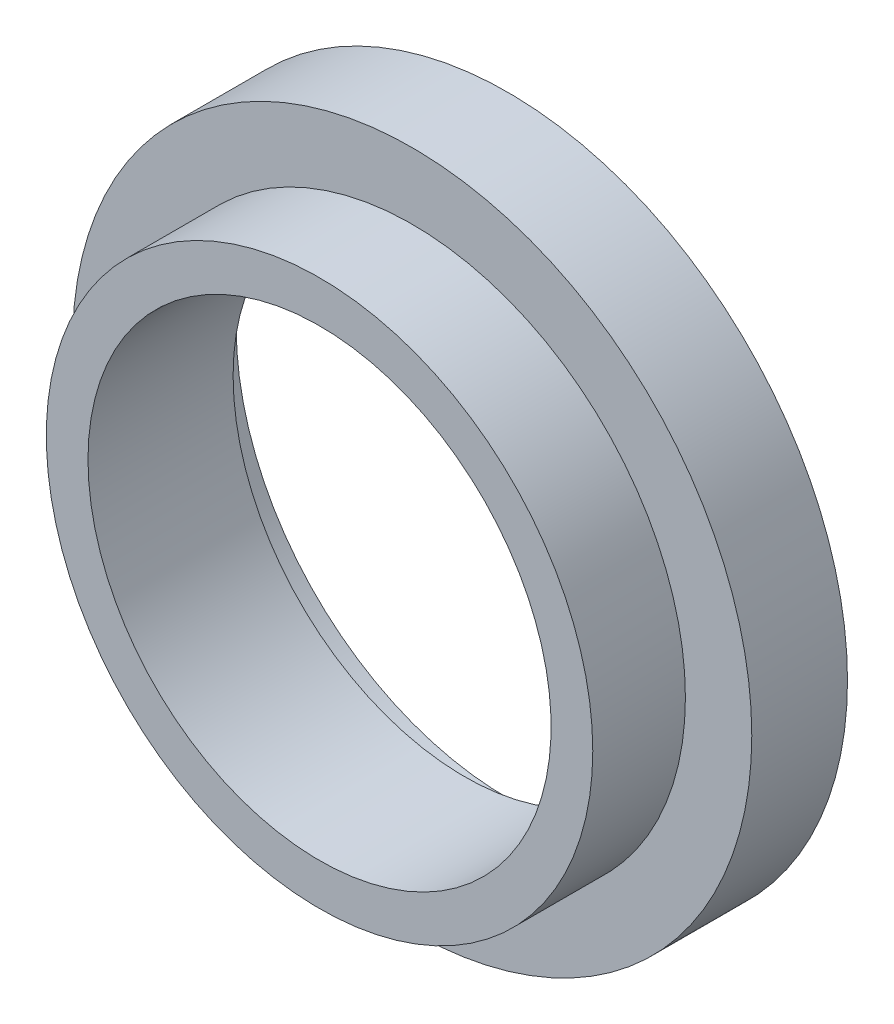
ISO-10303-21;
HEADER;
FILE_DESCRIPTION(('STEP AP214'),'2;1');
FILE_NAME('part.step','',(''),(''),'','','');
FILE_SCHEMA(('AUTOMOTIVE_DESIGN { 1 0 10303 214 1 1 1 1 }'));
ENDSEC;
DATA;
#1=APPLICATION_CONTEXT('core data for automotive mechanical design processes');
#2=APPLICATION_PROTOCOL_DEFINITION('international standard','automotive_design',2000,#1);
#3=PRODUCT_CONTEXT('',#1,'mechanical');
#4=PRODUCT('Part','Part','',(#3));
#5=PRODUCT_RELATED_PRODUCT_CATEGORY('part','',(#4));
#6=PRODUCT_DEFINITION_FORMATION('','',#4);
#7=PRODUCT_DEFINITION_CONTEXT('part definition',#1,'design');
#8=PRODUCT_DEFINITION('design','',#6,#7);
#9=PRODUCT_DEFINITION_SHAPE('','',#8);
#10=(LENGTH_UNIT() NAMED_UNIT(*) SI_UNIT(.MILLI.,.METRE.));
#11=(NAMED_UNIT(*) PLANE_ANGLE_UNIT() SI_UNIT($,.RADIAN.));
#12=(NAMED_UNIT(*) SI_UNIT($,.STERADIAN.) SOLID_ANGLE_UNIT());
#13=UNCERTAINTY_MEASURE_WITH_UNIT(LENGTH_MEASURE(1.E-05),#10,'distance_accuracy_value','');
#14=(GEOMETRIC_REPRESENTATION_CONTEXT(3) GLOBAL_UNCERTAINTY_ASSIGNED_CONTEXT((#13)) GLOBAL_UNIT_ASSIGNED_CONTEXT((#10,
#11,#12)) REPRESENTATION_CONTEXT('',''));
#15=CARTESIAN_POINT('',(0.,0.,0.));
#16=DIRECTION('',(0.,0.,1.));
#17=DIRECTION('',(1.,0.,0.));
#18=AXIS2_PLACEMENT_3D('',#15,#16,#17);
#19=CARTESIAN_POINT('',(0.,0.,15.5));
#20=DIRECTION('',(0.,0.,-1.));
#21=DIRECTION('',(-1.,0.,0.));
#22=AXIS2_PLACEMENT_3D('',#19,#20,#21);
#23=CYLINDRICAL_SURFACE('',#22,55.);
#24=CARTESIAN_POINT('',(0.,0.,15.5));
#25=DIRECTION('',(0.,0.,1.));
#26=DIRECTION('',(1.,0.,0.));
#27=AXIS2_PLACEMENT_3D('',#24,#25,#26);
#28=CIRCLE('',#27,55.);
#29=CARTESIAN_POINT('',(55.,0.,15.5));
#30=VERTEX_POINT('',#29);
#31=EDGE_CURVE('E41',#30,#30,#28,.T.);
#32=ORIENTED_EDGE('',*,*,#31,.F.);
#33=EDGE_LOOP('',(#32));
#34=FACE_BOUND('',#33,.T.);
#35=CARTESIAN_POINT('',(0.,0.,0.));
#36=DIRECTION('',(0.,0.,1.));
#37=DIRECTION('',(1.,0.,0.));
#38=AXIS2_PLACEMENT_3D('',#35,#36,#37);
#39=CIRCLE('',#38,55.);
#40=CARTESIAN_POINT('',(55.,0.,0.));
#41=VERTEX_POINT('',#40);
#42=EDGE_CURVE('E46',#41,#41,#39,.T.);
#43=ORIENTED_EDGE('',*,*,#42,.T.);
#44=EDGE_LOOP('',(#43));
#45=FACE_BOUND('',#44,.T.);
#46=ADVANCED_FACE('F34',(#34,#45),#23,.T.);
#47=CARTESIAN_POINT('',(0.,0.,15.5));
#48=DIRECTION('',(0.,0.,1.));
#49=DIRECTION('',(1.,0.,0.));
#50=AXIS2_PLACEMENT_3D('',#47,#48,#49);
#51=PLANE('',#50);
#52=CARTESIAN_POINT('',(0.,0.,15.5));
#53=DIRECTION('',(0.,0.,1.));
#54=DIRECTION('',(1.,0.,0.));
#55=AXIS2_PLACEMENT_3D('',#52,#53,#54);
#56=CIRCLE('',#55,44.25);
#57=CARTESIAN_POINT('',(44.25,0.,15.5));
#58=VERTEX_POINT('',#57);
#59=EDGE_CURVE('E10',#58,#58,#56,.T.);
#60=ORIENTED_EDGE('',*,*,#59,.F.);
#61=EDGE_LOOP('',(#60));
#62=FACE_BOUND('',#61,.T.);
#63=ORIENTED_EDGE('',*,*,#31,.T.);
#64=EDGE_LOOP('',(#63));
#65=FACE_BOUND('',#64,.T.);
#66=ADVANCED_FACE('F88',(#62,#65),#51,.T.);
#67=CARTESIAN_POINT('',(0.,0.,0.));
#68=DIRECTION('',(0.,0.,1.));
#69=DIRECTION('',(1.,0.,0.));
#70=AXIS2_PLACEMENT_3D('',#67,#68,#69);
#71=PLANE('',#70);
#72=CARTESIAN_POINT('',(0.,0.,0.));
#73=DIRECTION('',(0.,0.,-1.));
#74=DIRECTION('',(-1.,0.,0.));
#75=AXIS2_PLACEMENT_3D('',#72,#73,#74);
#76=CIRCLE('',#75,44.);
#77=CARTESIAN_POINT('',(-44.,0.,0.));
#78=VERTEX_POINT('',#77);
#79=EDGE_CURVE('E59',#78,#78,#76,.T.);
#80=ORIENTED_EDGE('',*,*,#79,.F.);
#81=EDGE_LOOP('',(#80));
#82=FACE_BOUND('',#81,.T.);
#83=ORIENTED_EDGE('',*,*,#42,.F.);
#84=EDGE_LOOP('',(#83));
#85=FACE_BOUND('',#84,.T.);
#86=ADVANCED_FACE('F93',(#82,#85),#71,.F.);
#87=CARTESIAN_POINT('',(0.,0.,30.5));
#88=DIRECTION('',(0.,0.,-1.));
#89=DIRECTION('',(-1.,0.,0.));
#90=AXIS2_PLACEMENT_3D('',#87,#88,#89);
#91=CYLINDRICAL_SURFACE('',#90,44.25);
#92=CARTESIAN_POINT('',(0.,0.,30.5));
#93=DIRECTION('',(0.,0.,1.));
#94=DIRECTION('',(1.,0.,0.));
#95=AXIS2_PLACEMENT_3D('',#92,#93,#94);
#96=CIRCLE('',#95,44.25);
#97=CARTESIAN_POINT('',(44.25,0.,30.5));
#98=VERTEX_POINT('',#97);
#99=EDGE_CURVE('E49',#98,#98,#96,.T.);
#100=ORIENTED_EDGE('',*,*,#99,.F.);
#101=EDGE_LOOP('',(#100));
#102=FACE_BOUND('',#101,.T.);
#103=ORIENTED_EDGE('',*,*,#59,.T.);
#104=EDGE_LOOP('',(#103));
#105=FACE_BOUND('',#104,.T.);
#106=ADVANCED_FACE('F101',(#102,#105),#91,.T.);
#107=CARTESIAN_POINT('',(0.,0.,30.5));
#108=DIRECTION('',(0.,0.,1.));
#109=DIRECTION('',(1.,0.,0.));
#110=AXIS2_PLACEMENT_3D('',#107,#108,#109);
#111=PLANE('',#110);
#112=CARTESIAN_POINT('',(0.,0.,30.5));
#113=DIRECTION('',(0.,0.,-1.));
#114=DIRECTION('',(-1.,0.,0.));
#115=AXIS2_PLACEMENT_3D('',#112,#113,#114);
#116=CIRCLE('',#115,37.5);
#117=CARTESIAN_POINT('',(-37.5,0.,30.5));
#118=VERTEX_POINT('',#117);
#119=EDGE_CURVE('E65',#118,#118,#116,.T.);
#120=ORIENTED_EDGE('',*,*,#119,.T.);
#121=EDGE_LOOP('',(#120));
#122=FACE_BOUND('',#121,.T.);
#123=ORIENTED_EDGE('',*,*,#99,.T.);
#124=EDGE_LOOP('',(#123));
#125=FACE_BOUND('',#124,.T.);
#126=ADVANCED_FACE('F84',(#122,#125),#111,.T.);
#127=CARTESIAN_POINT('',(0.,0.,7.));
#128=DIRECTION('',(0.,0.,-1.));
#129=DIRECTION('',(-1.,0.,0.));
#130=AXIS2_PLACEMENT_3D('',#127,#128,#129);
#131=CYLINDRICAL_SURFACE('',#130,44.);
#132=CARTESIAN_POINT('',(0.,0.,7.));
#133=DIRECTION('',(0.,0.,-1.));
#134=DIRECTION('',(-1.,0.,0.));
#135=AXIS2_PLACEMENT_3D('',#132,#133,#134);
#136=CIRCLE('',#135,44.);
#137=CARTESIAN_POINT('',(-44.,0.,7.));
#138=VERTEX_POINT('',#137);
#139=EDGE_CURVE('E55',#138,#138,#136,.T.);
#140=ORIENTED_EDGE('',*,*,#139,.F.);
#141=EDGE_LOOP('',(#140));
#142=FACE_BOUND('',#141,.T.);
#143=ORIENTED_EDGE('',*,*,#79,.T.);
#144=EDGE_LOOP('',(#143));
#145=FACE_BOUND('',#144,.T.);
#146=ADVANCED_FACE('F77',(#142,#145),#131,.F.);
#147=CARTESIAN_POINT('',(0.,0.,7.));
#148=DIRECTION('',(0.,0.,-1.));
#149=DIRECTION('',(-1.,0.,0.));
#150=AXIS2_PLACEMENT_3D('',#147,#148,#149);
#151=PLANE('',#150);
#152=CARTESIAN_POINT('',(0.,0.,7.));
#153=DIRECTION('',(0.,0.,-1.));
#154=DIRECTION('',(-1.,0.,0.));
#155=AXIS2_PLACEMENT_3D('',#152,#153,#154);
#156=CIRCLE('',#155,37.5);
#157=CARTESIAN_POINT('',(-37.5,0.,7.));
#158=VERTEX_POINT('',#157);
#159=EDGE_CURVE('E37',#158,#158,#156,.T.);
#160=ORIENTED_EDGE('',*,*,#159,.F.);
#161=EDGE_LOOP('',(#160));
#162=FACE_BOUND('',#161,.T.);
#163=ORIENTED_EDGE('',*,*,#139,.T.);
#164=EDGE_LOOP('',(#163));
#165=FACE_BOUND('',#164,.T.);
#166=ADVANCED_FACE('F75',(#162,#165),#151,.T.);
#167=CARTESIAN_POINT('',(0.,0.,30.5));
#168=DIRECTION('',(0.,0.,-1.));
#169=DIRECTION('',(-1.,0.,0.));
#170=AXIS2_PLACEMENT_3D('',#167,#168,#169);
#171=CYLINDRICAL_SURFACE('',#170,37.5);
#172=ORIENTED_EDGE('',*,*,#159,.T.);
#173=EDGE_LOOP('',(#172));
#174=FACE_BOUND('',#173,.T.);
#175=ORIENTED_EDGE('',*,*,#119,.F.);
#176=EDGE_LOOP('',(#175));
#177=FACE_BOUND('',#176,.T.);
#178=ADVANCED_FACE('F72',(#174,#177),#171,.F.);
#179=CLOSED_SHELL('',(#46,#66,#86,#106,#126,#146,#166,#178));
#180=MANIFOLD_SOLID_BREP('B2',#179);
#181=ADVANCED_BREP_SHAPE_REPRESENTATION('',(#18,#180),#14);
#182=SHAPE_DEFINITION_REPRESENTATION(#9,#181);
ENDSEC;
END-ISO-10303-21;
